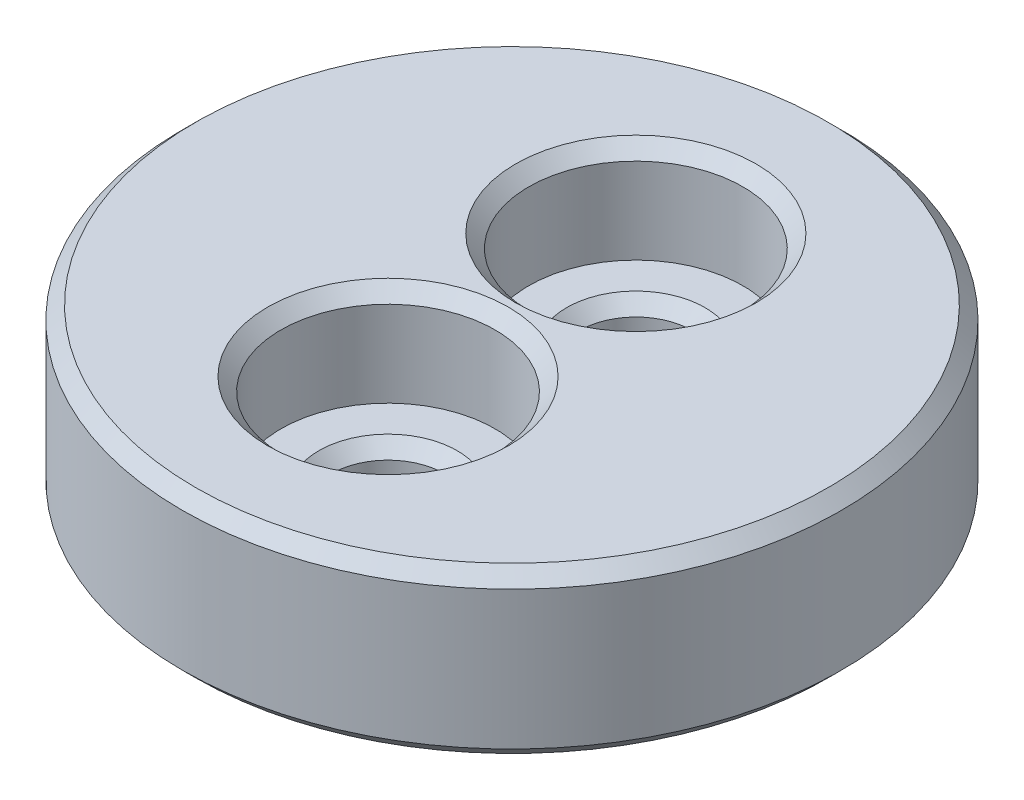
ISO-10303-21;
HEADER;
FILE_DESCRIPTION(('STEP AP214'),'2;1');
FILE_NAME('part.step','',(''),(''),'','','');
FILE_SCHEMA(('AUTOMOTIVE_DESIGN { 1 0 10303 214 1 1 1 1 }'));
ENDSEC;
DATA;
#1=APPLICATION_CONTEXT('core data for automotive mechanical design processes');
#2=APPLICATION_PROTOCOL_DEFINITION('international standard','automotive_design',2000,#1);
#3=PRODUCT_CONTEXT('',#1,'mechanical');
#4=PRODUCT('Part','Part','',(#3));
#5=PRODUCT_RELATED_PRODUCT_CATEGORY('part','',(#4));
#6=PRODUCT_DEFINITION_FORMATION('','',#4);
#7=PRODUCT_DEFINITION_CONTEXT('part definition',#1,'design');
#8=PRODUCT_DEFINITION('design','',#6,#7);
#9=PRODUCT_DEFINITION_SHAPE('','',#8);
#10=(LENGTH_UNIT() NAMED_UNIT(*) SI_UNIT(.MILLI.,.METRE.));
#11=(NAMED_UNIT(*) PLANE_ANGLE_UNIT() SI_UNIT($,.RADIAN.));
#12=(NAMED_UNIT(*) SI_UNIT($,.STERADIAN.) SOLID_ANGLE_UNIT());
#13=UNCERTAINTY_MEASURE_WITH_UNIT(LENGTH_MEASURE(1.E-05),#10,'distance_accuracy_value','');
#14=(GEOMETRIC_REPRESENTATION_CONTEXT(3) GLOBAL_UNCERTAINTY_ASSIGNED_CONTEXT((#13)) GLOBAL_UNIT_ASSIGNED_CONTEXT((#10,
#11,#12)) REPRESENTATION_CONTEXT('',''));
#15=CARTESIAN_POINT('',(0.,0.,0.));
#16=DIRECTION('',(0.,0.,1.));
#17=DIRECTION('',(1.,0.,0.));
#18=AXIS2_PLACEMENT_3D('',#15,#16,#17);
#19=CARTESIAN_POINT('',(0.,5.,0.));
#20=DIRECTION('',(0.,-1.,0.));
#21=DIRECTION('',(0.,0.,-1.));
#22=AXIS2_PLACEMENT_3D('',#19,#20,#21);
#23=CYLINDRICAL_SURFACE('',#22,10.);
#24=CARTESIAN_POINT('',(0.,0.399999999999996,0.));
#25=DIRECTION('',(0.,1.,0.));
#26=DIRECTION('',(0.,0.,1.));
#27=AXIS2_PLACEMENT_3D('',#24,#25,#26);
#28=CIRCLE('',#27,10.);
#29=CARTESIAN_POINT('',(0.,0.399999999999996,10.));
#30=VERTEX_POINT('',#29);
#31=EDGE_CURVE('E45',#30,#30,#28,.T.);
#32=ORIENTED_EDGE('',*,*,#31,.T.);
#33=EDGE_LOOP('',(#32));
#34=FACE_BOUND('',#33,.T.);
#35=CARTESIAN_POINT('',(0.,4.59999999999999,0.));
#36=DIRECTION('',(0.,1.,0.));
#37=DIRECTION('',(0.,0.,1.));
#38=AXIS2_PLACEMENT_3D('',#35,#36,#37);
#39=CIRCLE('',#38,10.);
#40=CARTESIAN_POINT('',(0.,4.59999999999999,10.));
#41=VERTEX_POINT('',#40);
#42=EDGE_CURVE('E49',#41,#41,#39,.F.);
#43=ORIENTED_EDGE('',*,*,#42,.T.);
#44=EDGE_LOOP('',(#43));
#45=FACE_BOUND('',#44,.T.);
#46=ADVANCED_FACE('F33',(#34,#45),#23,.T.);
#47=CARTESIAN_POINT('',(0.,5.,0.));
#48=DIRECTION('',(0.,1.,0.));
#49=DIRECTION('',(0.,0.,1.));
#50=AXIS2_PLACEMENT_3D('',#47,#48,#49);
#51=PLANE('',#50);
#52=CARTESIAN_POINT('',(0.,5.,0.));
#53=DIRECTION('',(0.,1.,0.));
#54=DIRECTION('',(0.,0.,1.));
#55=AXIS2_PLACEMENT_3D('',#52,#53,#54);
#56=CIRCLE('',#55,9.6);
#57=CARTESIAN_POINT('',(0.,5.,9.6));
#58=VERTEX_POINT('',#57);
#59=EDGE_CURVE('E10',#58,#58,#56,.T.);
#60=ORIENTED_EDGE('',*,*,#59,.T.);
#61=EDGE_LOOP('',(#60));
#62=FACE_BOUND('',#61,.T.);
#63=CARTESIAN_POINT('',(0.,5.,-3.76));
#64=DIRECTION('',(0.,1.,0.));
#65=DIRECTION('',(0.,0.,1.));
#66=AXIS2_PLACEMENT_3D('',#63,#64,#65);
#67=CIRCLE('',#66,3.65);
#68=CARTESIAN_POINT('',(0.,5.,-0.109999999999999));
#69=VERTEX_POINT('',#68);
#70=EDGE_CURVE('E90',#69,#69,#67,.T.);
#71=ORIENTED_EDGE('',*,*,#70,.F.);
#72=EDGE_LOOP('',(#71));
#73=FACE_BOUND('',#72,.T.);
#74=CARTESIAN_POINT('',(0.,5.,3.76));
#75=DIRECTION('',(0.,1.,0.));
#76=DIRECTION('',(0.,0.,1.));
#77=AXIS2_PLACEMENT_3D('',#74,#75,#76);
#78=CIRCLE('',#77,3.65);
#79=CARTESIAN_POINT('',(0.,5.,7.41));
#80=VERTEX_POINT('',#79);
#81=EDGE_CURVE('E69',#80,#80,#78,.T.);
#82=ORIENTED_EDGE('',*,*,#81,.F.);
#83=EDGE_LOOP('',(#82));
#84=FACE_BOUND('',#83,.T.);
#85=ADVANCED_FACE('F138',(#62,#73,#84),#51,.T.);
#86=CARTESIAN_POINT('',(0.,0.,0.));
#87=DIRECTION('',(0.,1.,0.));
#88=DIRECTION('',(0.,0.,1.));
#89=AXIS2_PLACEMENT_3D('',#86,#87,#88);
#90=PLANE('',#89);
#91=CARTESIAN_POINT('',(0.,0.,0.));
#92=DIRECTION('',(0.,1.,0.));
#93=DIRECTION('',(0.,0.,1.));
#94=AXIS2_PLACEMENT_3D('',#91,#92,#93);
#95=CIRCLE('',#94,9.6);
#96=CARTESIAN_POINT('',(0.,0.,9.6));
#97=VERTEX_POINT('',#96);
#98=EDGE_CURVE('E41',#97,#97,#95,.F.);
#99=ORIENTED_EDGE('',*,*,#98,.T.);
#100=EDGE_LOOP('',(#99));
#101=FACE_BOUND('',#100,.T.);
#102=CARTESIAN_POINT('',(0.,0.,-3.76));
#103=DIRECTION('',(0.,1.,0.));
#104=DIRECTION('',(0.,0.,1.));
#105=AXIS2_PLACEMENT_3D('',#102,#103,#104);
#106=CIRCLE('',#105,2.1);
#107=CARTESIAN_POINT('',(0.,0.,-1.66));
#108=VERTEX_POINT('',#107);
#109=EDGE_CURVE('E93',#108,#108,#106,.T.);
#110=ORIENTED_EDGE('',*,*,#109,.T.);
#111=EDGE_LOOP('',(#110));
#112=FACE_BOUND('',#111,.T.);
#113=CARTESIAN_POINT('',(0.,0.,3.76));
#114=DIRECTION('',(0.,1.,0.));
#115=DIRECTION('',(0.,0.,1.));
#116=AXIS2_PLACEMENT_3D('',#113,#114,#115);
#117=CIRCLE('',#116,2.1);
#118=CARTESIAN_POINT('',(0.,0.,5.86));
#119=VERTEX_POINT('',#118);
#120=EDGE_CURVE('E72',#119,#119,#117,.T.);
#121=ORIENTED_EDGE('',*,*,#120,.T.);
#122=EDGE_LOOP('',(#121));
#123=FACE_BOUND('',#122,.T.);
#124=ADVANCED_FACE('F97',(#101,#112,#123),#90,.F.);
#125=CARTESIAN_POINT('',(0.,0.400000000000002,3.76));
#126=DIRECTION('',(0.,-1.,0.));
#127=DIRECTION('',(0.,0.,-1.));
#128=AXIS2_PLACEMENT_3D('',#125,#126,#127);
#129=CONICAL_SURFACE('',#128,1.7,0.785398163397448);
#130=ORIENTED_EDGE('',*,*,#120,.F.);
#131=EDGE_LOOP('',(#130));
#132=FACE_BOUND('',#131,.T.);
#133=CARTESIAN_POINT('',(0.,0.400000000000002,3.76));
#134=DIRECTION('',(0.,1.,0.));
#135=DIRECTION('',(0.,0.,1.));
#136=AXIS2_PLACEMENT_3D('',#133,#134,#135);
#137=CIRCLE('',#136,1.7);
#138=CARTESIAN_POINT('',(0.,0.400000000000002,5.46));
#139=VERTEX_POINT('',#138);
#140=EDGE_CURVE('E54',#139,#139,#137,.T.);
#141=ORIENTED_EDGE('',*,*,#140,.T.);
#142=EDGE_LOOP('',(#141));
#143=FACE_BOUND('',#142,.T.);
#144=ADVANCED_FACE('F191',(#132,#143),#129,.F.);
#145=CARTESIAN_POINT('',(0.,5.,3.76));
#146=DIRECTION('',(0.,1.,0.));
#147=DIRECTION('',(0.,0.,1.));
#148=AXIS2_PLACEMENT_3D('',#145,#146,#147);
#149=CYLINDRICAL_SURFACE('',#148,1.7);
#150=ORIENTED_EDGE('',*,*,#140,.F.);
#151=EDGE_LOOP('',(#150));
#152=FACE_BOUND('',#151,.T.);
#153=CARTESIAN_POINT('',(0.,1.6,3.76));
#154=DIRECTION('',(0.,1.,0.));
#155=DIRECTION('',(0.,0.,1.));
#156=AXIS2_PLACEMENT_3D('',#153,#154,#155);
#157=CIRCLE('',#156,1.7);
#158=CARTESIAN_POINT('',(0.,1.6,5.46));
#159=VERTEX_POINT('',#158);
#160=EDGE_CURVE('E57',#159,#159,#157,.T.);
#161=ORIENTED_EDGE('',*,*,#160,.T.);
#162=EDGE_LOOP('',(#161));
#163=FACE_BOUND('',#162,.T.);
#164=ADVANCED_FACE('F266',(#152,#163),#149,.F.);
#165=CARTESIAN_POINT('',(0.,2.,3.76));
#166=DIRECTION('',(0.,1.,0.));
#167=DIRECTION('',(0.,0.,1.));
#168=AXIS2_PLACEMENT_3D('',#165,#166,#167);
#169=CONICAL_SURFACE('',#168,2.1,0.785398163397451);
#170=ORIENTED_EDGE('',*,*,#160,.F.);
#171=EDGE_LOOP('',(#170));
#172=FACE_BOUND('',#171,.T.);
#173=CARTESIAN_POINT('',(0.,2.,3.76));
#174=DIRECTION('',(0.,1.,0.));
#175=DIRECTION('',(0.,0.,1.));
#176=AXIS2_PLACEMENT_3D('',#173,#174,#175);
#177=CIRCLE('',#176,2.1);
#178=CARTESIAN_POINT('',(0.,2.,5.86));
#179=VERTEX_POINT('',#178);
#180=EDGE_CURVE('E60',#179,#179,#177,.T.);
#181=ORIENTED_EDGE('',*,*,#180,.T.);
#182=EDGE_LOOP('',(#181));
#183=FACE_BOUND('',#182,.T.);
#184=ADVANCED_FACE('F256',(#172,#183),#169,.F.);
#185=CARTESIAN_POINT('',(2.1,2.,3.76));
#186=DIRECTION('',(0.,-1.,0.));
#187=DIRECTION('',(0.,0.,-1.));
#188=AXIS2_PLACEMENT_3D('',#185,#186,#187);
#189=PLANE('',#188);
#190=ORIENTED_EDGE('',*,*,#180,.F.);
#191=EDGE_LOOP('',(#190));
#192=FACE_BOUND('',#191,.T.);
#193=CARTESIAN_POINT('',(0.,2.,3.76));
#194=DIRECTION('',(0.,1.,0.));
#195=DIRECTION('',(0.,0.,1.));
#196=AXIS2_PLACEMENT_3D('',#193,#194,#195);
#197=CIRCLE('',#196,3.25);
#198=CARTESIAN_POINT('',(0.,2.,7.01));
#199=VERTEX_POINT('',#198);
#200=EDGE_CURVE('E63',#199,#199,#197,.T.);
#201=ORIENTED_EDGE('',*,*,#200,.T.);
#202=EDGE_LOOP('',(#201));
#203=FACE_BOUND('',#202,.T.);
#204=ADVANCED_FACE('F151',(#192,#203),#189,.F.);
#205=CARTESIAN_POINT('',(0.,5.,3.76));
#206=DIRECTION('',(0.,1.,0.));
#207=DIRECTION('',(0.,0.,1.));
#208=AXIS2_PLACEMENT_3D('',#205,#206,#207);
#209=CYLINDRICAL_SURFACE('',#208,3.25);
#210=ORIENTED_EDGE('',*,*,#200,.F.);
#211=EDGE_LOOP('',(#210));
#212=FACE_BOUND('',#211,.T.);
#213=CARTESIAN_POINT('',(0.,4.6,3.76));
#214=DIRECTION('',(0.,1.,0.));
#215=DIRECTION('',(0.,0.,1.));
#216=AXIS2_PLACEMENT_3D('',#213,#214,#215);
#217=CIRCLE('',#216,3.25);
#218=CARTESIAN_POINT('',(0.,4.6,7.01));
#219=VERTEX_POINT('',#218);
#220=EDGE_CURVE('E66',#219,#219,#217,.T.);
#221=ORIENTED_EDGE('',*,*,#220,.T.);
#222=EDGE_LOOP('',(#221));
#223=FACE_BOUND('',#222,.T.);
#224=ADVANCED_FACE('F145',(#212,#223),#209,.F.);
#225=CARTESIAN_POINT('',(0.,5.,3.76));
#226=DIRECTION('',(0.,1.,0.));
#227=DIRECTION('',(0.,0.,1.));
#228=AXIS2_PLACEMENT_3D('',#225,#226,#227);
#229=CONICAL_SURFACE('',#228,3.65,0.78539816339745);
#230=ORIENTED_EDGE('',*,*,#220,.F.);
#231=EDGE_LOOP('',(#230));
#232=FACE_BOUND('',#231,.T.);
#233=ORIENTED_EDGE('',*,*,#81,.T.);
#234=EDGE_LOOP('',(#233));
#235=FACE_BOUND('',#234,.T.);
#236=ADVANCED_FACE('F104',(#232,#235),#229,.F.);
#237=CARTESIAN_POINT('',(0.,0.400000000000002,-3.76));
#238=DIRECTION('',(0.,-1.,0.));
#239=DIRECTION('',(0.,0.,-1.));
#240=AXIS2_PLACEMENT_3D('',#237,#238,#239);
#241=CONICAL_SURFACE('',#240,1.7,0.785398163397448);
#242=ORIENTED_EDGE('',*,*,#109,.F.);
#243=EDGE_LOOP('',(#242));
#244=FACE_BOUND('',#243,.T.);
#245=CARTESIAN_POINT('',(0.,0.400000000000002,-3.76));
#246=DIRECTION('',(0.,1.,0.));
#247=DIRECTION('',(0.,0.,1.));
#248=AXIS2_PLACEMENT_3D('',#245,#246,#247);
#249=CIRCLE('',#248,1.7);
#250=CARTESIAN_POINT('',(0.,0.400000000000002,-2.06));
#251=VERTEX_POINT('',#250);
#252=EDGE_CURVE('E75',#251,#251,#249,.T.);
#253=ORIENTED_EDGE('',*,*,#252,.T.);
#254=EDGE_LOOP('',(#253));
#255=FACE_BOUND('',#254,.T.);
#256=ADVANCED_FACE('F100',(#244,#255),#241,.F.);
#257=CARTESIAN_POINT('',(0.,5.,-3.76));
#258=DIRECTION('',(0.,1.,0.));
#259=DIRECTION('',(0.,0.,1.));
#260=AXIS2_PLACEMENT_3D('',#257,#258,#259);
#261=CYLINDRICAL_SURFACE('',#260,1.7);
#262=ORIENTED_EDGE('',*,*,#252,.F.);
#263=EDGE_LOOP('',(#262));
#264=FACE_BOUND('',#263,.T.);
#265=CARTESIAN_POINT('',(0.,1.6,-3.76));
#266=DIRECTION('',(0.,1.,0.));
#267=DIRECTION('',(0.,0.,1.));
#268=AXIS2_PLACEMENT_3D('',#265,#266,#267);
#269=CIRCLE('',#268,1.7);
#270=CARTESIAN_POINT('',(0.,1.6,-2.06));
#271=VERTEX_POINT('',#270);
#272=EDGE_CURVE('E78',#271,#271,#269,.T.);
#273=ORIENTED_EDGE('',*,*,#272,.T.);
#274=EDGE_LOOP('',(#273));
#275=FACE_BOUND('',#274,.T.);
#276=ADVANCED_FACE('F103',(#264,#275),#261,.F.);
#277=CARTESIAN_POINT('',(0.,2.,-3.76));
#278=DIRECTION('',(0.,1.,0.));
#279=DIRECTION('',(0.,0.,1.));
#280=AXIS2_PLACEMENT_3D('',#277,#278,#279);
#281=CONICAL_SURFACE('',#280,2.1,0.785398163397451);
#282=ORIENTED_EDGE('',*,*,#272,.F.);
#283=EDGE_LOOP('',(#282));
#284=FACE_BOUND('',#283,.T.);
#285=CARTESIAN_POINT('',(0.,2.,-3.76));
#286=DIRECTION('',(0.,1.,0.));
#287=DIRECTION('',(0.,0.,1.));
#288=AXIS2_PLACEMENT_3D('',#285,#286,#287);
#289=CIRCLE('',#288,2.1);
#290=CARTESIAN_POINT('',(0.,2.,-1.66));
#291=VERTEX_POINT('',#290);
#292=EDGE_CURVE('E81',#291,#291,#289,.T.);
#293=ORIENTED_EDGE('',*,*,#292,.T.);
#294=EDGE_LOOP('',(#293));
#295=FACE_BOUND('',#294,.T.);
#296=ADVANCED_FACE('F110',(#284,#295),#281,.F.);
#297=CARTESIAN_POINT('',(2.1,2.,-3.76));
#298=DIRECTION('',(0.,-1.,0.));
#299=DIRECTION('',(0.,0.,-1.));
#300=AXIS2_PLACEMENT_3D('',#297,#298,#299);
#301=PLANE('',#300);
#302=ORIENTED_EDGE('',*,*,#292,.F.);
#303=EDGE_LOOP('',(#302));
#304=FACE_BOUND('',#303,.T.);
#305=CARTESIAN_POINT('',(0.,2.,-3.76));
#306=DIRECTION('',(0.,1.,0.));
#307=DIRECTION('',(0.,0.,1.));
#308=AXIS2_PLACEMENT_3D('',#305,#306,#307);
#309=CIRCLE('',#308,3.25);
#310=CARTESIAN_POINT('',(0.,2.,-0.510000000000004));
#311=VERTEX_POINT('',#310);
#312=EDGE_CURVE('E84',#311,#311,#309,.T.);
#313=ORIENTED_EDGE('',*,*,#312,.T.);
#314=EDGE_LOOP('',(#313));
#315=FACE_BOUND('',#314,.T.);
#316=ADVANCED_FACE('F116',(#304,#315),#301,.F.);
#317=CARTESIAN_POINT('',(0.,5.,-3.76));
#318=DIRECTION('',(0.,1.,0.));
#319=DIRECTION('',(0.,0.,1.));
#320=AXIS2_PLACEMENT_3D('',#317,#318,#319);
#321=CYLINDRICAL_SURFACE('',#320,3.25);
#322=ORIENTED_EDGE('',*,*,#312,.F.);
#323=EDGE_LOOP('',(#322));
#324=FACE_BOUND('',#323,.T.);
#325=CARTESIAN_POINT('',(0.,4.6,-3.76));
#326=DIRECTION('',(0.,1.,0.));
#327=DIRECTION('',(0.,0.,1.));
#328=AXIS2_PLACEMENT_3D('',#325,#326,#327);
#329=CIRCLE('',#328,3.25);
#330=CARTESIAN_POINT('',(0.,4.6,-0.510000000000004));
#331=VERTEX_POINT('',#330);
#332=EDGE_CURVE('E87',#331,#331,#329,.T.);
#333=ORIENTED_EDGE('',*,*,#332,.T.);
#334=EDGE_LOOP('',(#333));
#335=FACE_BOUND('',#334,.T.);
#336=ADVANCED_FACE('F122',(#324,#335),#321,.F.);
#337=CARTESIAN_POINT('',(0.,5.,-3.76));
#338=DIRECTION('',(0.,1.,0.));
#339=DIRECTION('',(0.,0.,1.));
#340=AXIS2_PLACEMENT_3D('',#337,#338,#339);
#341=CONICAL_SURFACE('',#340,3.65,0.78539816339745);
#342=ORIENTED_EDGE('',*,*,#332,.F.);
#343=EDGE_LOOP('',(#342));
#344=FACE_BOUND('',#343,.T.);
#345=ORIENTED_EDGE('',*,*,#70,.T.);
#346=EDGE_LOOP('',(#345));
#347=FACE_BOUND('',#346,.T.);
#348=ADVANCED_FACE('F128',(#344,#347),#341,.F.);
#349=CARTESIAN_POINT('',(0.,0.399999999999996,0.));
#350=DIRECTION('',(0.,1.,0.));
#351=DIRECTION('',(0.,0.,1.));
#352=AXIS2_PLACEMENT_3D('',#349,#350,#351);
#353=CONICAL_SURFACE('',#352,10.,0.785398163397453);
#354=ORIENTED_EDGE('',*,*,#98,.F.);
#355=EDGE_LOOP('',(#354));
#356=FACE_BOUND('',#355,.T.);
#357=ORIENTED_EDGE('',*,*,#31,.F.);
#358=EDGE_LOOP('',(#357));
#359=FACE_BOUND('',#358,.T.);
#360=ADVANCED_FACE('F134',(#356,#359),#353,.T.);
#361=CARTESIAN_POINT('',(0.,5.,0.));
#362=DIRECTION('',(0.,-1.,0.));
#363=DIRECTION('',(0.,0.,-1.));
#364=AXIS2_PLACEMENT_3D('',#361,#362,#363);
#365=CONICAL_SURFACE('',#364,9.6,0.785398163397442);
#366=ORIENTED_EDGE('',*,*,#42,.F.);
#367=EDGE_LOOP('',(#366));
#368=FACE_BOUND('',#367,.T.);
#369=ORIENTED_EDGE('',*,*,#59,.F.);
#370=EDGE_LOOP('',(#369));
#371=FACE_BOUND('',#370,.T.);
#372=ADVANCED_FACE('F36',(#368,#371),#365,.T.);
#373=CLOSED_SHELL('',(#46,#85,#124,#144,#164,#184,#204,#224,#236,#256,#276,#296,#316,#336,#348,
#360,#372));
#374=MANIFOLD_SOLID_BREP('B2',#373);
#375=ADVANCED_BREP_SHAPE_REPRESENTATION('',(#18,#374),#14);
#376=SHAPE_DEFINITION_REPRESENTATION(#9,#375);
ENDSEC;
END-ISO-10303-21;
